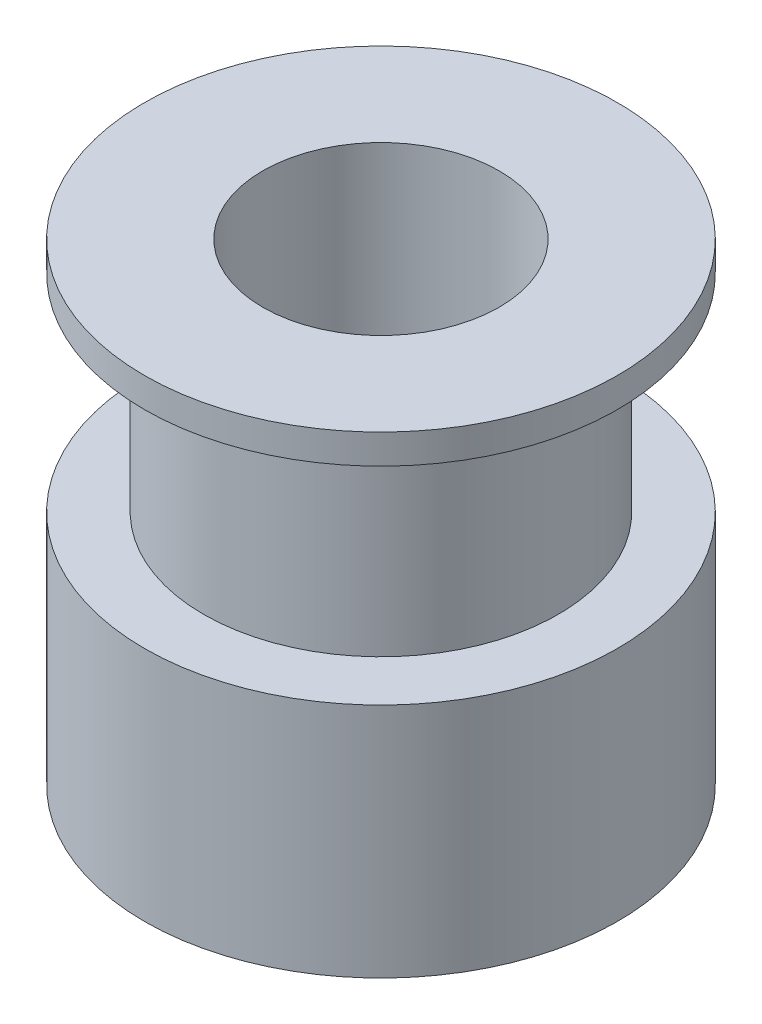
ISO-10303-21;
HEADER;
FILE_DESCRIPTION(('STEP AP214'),'2;1');
FILE_NAME('part.step','',(''),(''),'','','');
FILE_SCHEMA(('AUTOMOTIVE_DESIGN { 1 0 10303 214 1 1 1 1 }'));
ENDSEC;
DATA;
#1=APPLICATION_CONTEXT('core data for automotive mechanical design processes');
#2=APPLICATION_PROTOCOL_DEFINITION('international standard','automotive_design',2000,#1);
#3=PRODUCT_CONTEXT('',#1,'mechanical');
#4=PRODUCT('Part','Part','',(#3));
#5=PRODUCT_RELATED_PRODUCT_CATEGORY('part','',(#4));
#6=PRODUCT_DEFINITION_FORMATION('','',#4);
#7=PRODUCT_DEFINITION_CONTEXT('part definition',#1,'design');
#8=PRODUCT_DEFINITION('design','',#6,#7);
#9=PRODUCT_DEFINITION_SHAPE('','',#8);
#10=(LENGTH_UNIT() NAMED_UNIT(*) SI_UNIT(.MILLI.,.METRE.));
#11=(NAMED_UNIT(*) PLANE_ANGLE_UNIT() SI_UNIT($,.RADIAN.));
#12=(NAMED_UNIT(*) SI_UNIT($,.STERADIAN.) SOLID_ANGLE_UNIT());
#13=UNCERTAINTY_MEASURE_WITH_UNIT(LENGTH_MEASURE(1.E-05),#10,'distance_accuracy_value','');
#14=(GEOMETRIC_REPRESENTATION_CONTEXT(3) GLOBAL_UNCERTAINTY_ASSIGNED_CONTEXT((#13)) GLOBAL_UNIT_ASSIGNED_CONTEXT((#10,
#11,#12)) REPRESENTATION_CONTEXT('',''));
#15=CARTESIAN_POINT('',(0.,0.,0.));
#16=DIRECTION('',(0.,0.,1.));
#17=DIRECTION('',(1.,0.,0.));
#18=AXIS2_PLACEMENT_3D('',#15,#16,#17);
#19=CARTESIAN_POINT('',(0.,14.15,0.));
#20=DIRECTION('',(0.,1.,0.));
#21=DIRECTION('',(0.,0.,1.));
#22=AXIS2_PLACEMENT_3D('',#19,#20,#21);
#23=PLANE('',#22);
#24=CARTESIAN_POINT('',(0.,14.15,0.));
#25=DIRECTION('',(0.,-1.,0.));
#26=DIRECTION('',(0.,0.,-1.));
#27=AXIS2_PLACEMENT_3D('',#24,#25,#26);
#28=CIRCLE('',#27,4.);
#29=CARTESIAN_POINT('',(0.,14.15,-4.));
#30=VERTEX_POINT('',#29);
#31=EDGE_CURVE('E62',#30,#30,#28,.T.);
#32=ORIENTED_EDGE('',*,*,#31,.T.);
#33=EDGE_LOOP('',(#32));
#34=FACE_BOUND('',#33,.T.);
#35=CARTESIAN_POINT('',(0.,14.15,0.));
#36=DIRECTION('',(0.,1.,0.));
#37=DIRECTION('',(0.,0.,1.));
#38=AXIS2_PLACEMENT_3D('',#35,#36,#37);
#39=CIRCLE('',#38,8.);
#40=CARTESIAN_POINT('',(0.,14.15,8.));
#41=VERTEX_POINT('',#40);
#42=EDGE_CURVE('E10',#41,#41,#39,.T.);
#43=ORIENTED_EDGE('',*,*,#42,.T.);
#44=EDGE_LOOP('',(#43));
#45=FACE_BOUND('',#44,.T.);
#46=ADVANCED_FACE('F37',(#34,#45),#23,.T.);
#47=CARTESIAN_POINT('',(0.,15.9,0.));
#48=DIRECTION('',(0.,1.,0.));
#49=DIRECTION('',(0.,0.,1.));
#50=AXIS2_PLACEMENT_3D('',#47,#48,#49);
#51=CYLINDRICAL_SURFACE('',#50,8.);
#52=CARTESIAN_POINT('',(0.,13.15,0.));
#53=DIRECTION('',(0.,1.,0.));
#54=DIRECTION('',(0.,0.,1.));
#55=AXIS2_PLACEMENT_3D('',#52,#53,#54);
#56=CIRCLE('',#55,8.);
#57=CARTESIAN_POINT('',(0.,13.15,8.));
#58=VERTEX_POINT('',#57);
#59=EDGE_CURVE('E43',#58,#58,#56,.T.);
#60=ORIENTED_EDGE('',*,*,#59,.T.);
#61=EDGE_LOOP('',(#60));
#62=FACE_BOUND('',#61,.T.);
#63=ORIENTED_EDGE('',*,*,#42,.F.);
#64=EDGE_LOOP('',(#63));
#65=FACE_BOUND('',#64,.T.);
#66=ADVANCED_FACE('F103',(#62,#65),#51,.T.);
#67=CARTESIAN_POINT('',(-8.,13.15,0.));
#68=DIRECTION('',(0.,-1.,0.));
#69=DIRECTION('',(0.,0.,-1.));
#70=AXIS2_PLACEMENT_3D('',#67,#68,#69);
#71=PLANE('',#70);
#72=CARTESIAN_POINT('',(0.,13.15,0.));
#73=DIRECTION('',(0.,1.,0.));
#74=DIRECTION('',(0.,0.,1.));
#75=AXIS2_PLACEMENT_3D('',#72,#73,#74);
#76=CIRCLE('',#75,6.);
#77=CARTESIAN_POINT('',(0.,13.15,6.));
#78=VERTEX_POINT('',#77);
#79=EDGE_CURVE('E47',#78,#78,#76,.T.);
#80=ORIENTED_EDGE('',*,*,#79,.T.);
#81=EDGE_LOOP('',(#80));
#82=FACE_BOUND('',#81,.T.);
#83=ORIENTED_EDGE('',*,*,#59,.F.);
#84=EDGE_LOOP('',(#83));
#85=FACE_BOUND('',#84,.T.);
#86=ADVANCED_FACE('F97',(#82,#85),#71,.T.);
#87=CARTESIAN_POINT('',(0.,15.9,0.));
#88=DIRECTION('',(0.,1.,0.));
#89=DIRECTION('',(0.,0.,1.));
#90=AXIS2_PLACEMENT_3D('',#87,#88,#89);
#91=CYLINDRICAL_SURFACE('',#90,6.);
#92=CARTESIAN_POINT('',(0.,6.15,0.));
#93=DIRECTION('',(0.,1.,0.));
#94=DIRECTION('',(0.,0.,1.));
#95=AXIS2_PLACEMENT_3D('',#92,#93,#94);
#96=CIRCLE('',#95,6.);
#97=CARTESIAN_POINT('',(0.,6.15,6.));
#98=VERTEX_POINT('',#97);
#99=EDGE_CURVE('E51',#98,#98,#96,.T.);
#100=ORIENTED_EDGE('',*,*,#99,.T.);
#101=EDGE_LOOP('',(#100));
#102=FACE_BOUND('',#101,.T.);
#103=ORIENTED_EDGE('',*,*,#79,.F.);
#104=EDGE_LOOP('',(#103));
#105=FACE_BOUND('',#104,.T.);
#106=ADVANCED_FACE('F91',(#102,#105),#91,.T.);
#107=CARTESIAN_POINT('',(-6.,6.14999999999999,0.));
#108=DIRECTION('',(0.,1.,0.));
#109=DIRECTION('',(0.,0.,1.));
#110=AXIS2_PLACEMENT_3D('',#107,#108,#109);
#111=PLANE('',#110);
#112=CARTESIAN_POINT('',(0.,6.14999999999999,0.));
#113=DIRECTION('',(0.,1.,0.));
#114=DIRECTION('',(0.,0.,1.));
#115=AXIS2_PLACEMENT_3D('',#112,#113,#114);
#116=CIRCLE('',#115,8.);
#117=CARTESIAN_POINT('',(0.,6.14999999999999,8.));
#118=VERTEX_POINT('',#117);
#119=EDGE_CURVE('E56',#118,#118,#116,.T.);
#120=ORIENTED_EDGE('',*,*,#119,.T.);
#121=EDGE_LOOP('',(#120));
#122=FACE_BOUND('',#121,.T.);
#123=ORIENTED_EDGE('',*,*,#99,.F.);
#124=EDGE_LOOP('',(#123));
#125=FACE_BOUND('',#124,.T.);
#126=ADVANCED_FACE('F85',(#122,#125),#111,.T.);
#127=CARTESIAN_POINT('',(0.,15.9,0.));
#128=DIRECTION('',(0.,1.,0.));
#129=DIRECTION('',(0.,0.,1.));
#130=AXIS2_PLACEMENT_3D('',#127,#128,#129);
#131=CYLINDRICAL_SURFACE('',#130,8.);
#132=CARTESIAN_POINT('',(0.,-1.85,0.));
#133=DIRECTION('',(0.,1.,0.));
#134=DIRECTION('',(0.,0.,1.));
#135=AXIS2_PLACEMENT_3D('',#132,#133,#134);
#136=CIRCLE('',#135,8.);
#137=CARTESIAN_POINT('',(0.,-1.85,8.));
#138=VERTEX_POINT('',#137);
#139=EDGE_CURVE('E59',#138,#138,#136,.T.);
#140=ORIENTED_EDGE('',*,*,#139,.T.);
#141=EDGE_LOOP('',(#140));
#142=FACE_BOUND('',#141,.T.);
#143=ORIENTED_EDGE('',*,*,#119,.F.);
#144=EDGE_LOOP('',(#143));
#145=FACE_BOUND('',#144,.T.);
#146=ADVANCED_FACE('F79',(#142,#145),#131,.T.);
#147=CARTESIAN_POINT('',(-8.,-1.85,0.));
#148=DIRECTION('',(0.,-1.,0.));
#149=DIRECTION('',(0.,0.,-1.));
#150=AXIS2_PLACEMENT_3D('',#147,#148,#149);
#151=PLANE('',#150);
#152=CARTESIAN_POINT('',(0.,-1.85,0.));
#153=DIRECTION('',(0.,-1.,0.));
#154=DIRECTION('',(0.,0.,-1.));
#155=AXIS2_PLACEMENT_3D('',#152,#153,#154);
#156=CIRCLE('',#155,4.);
#157=CARTESIAN_POINT('',(0.,-1.85,-4.));
#158=VERTEX_POINT('',#157);
#159=EDGE_CURVE('E63',#158,#158,#156,.T.);
#160=ORIENTED_EDGE('',*,*,#159,.F.);
#161=EDGE_LOOP('',(#160));
#162=FACE_BOUND('',#161,.T.);
#163=ORIENTED_EDGE('',*,*,#139,.F.);
#164=EDGE_LOOP('',(#163));
#165=FACE_BOUND('',#164,.T.);
#166=ADVANCED_FACE('F73',(#162,#165),#151,.T.);
#167=CARTESIAN_POINT('',(0.,14.15,0.));
#168=DIRECTION('',(0.,-1.,0.));
#169=DIRECTION('',(0.,0.,-1.));
#170=AXIS2_PLACEMENT_3D('',#167,#168,#169);
#171=CYLINDRICAL_SURFACE('',#170,4.);
#172=ORIENTED_EDGE('',*,*,#31,.F.);
#173=EDGE_LOOP('',(#172));
#174=FACE_BOUND('',#173,.T.);
#175=ORIENTED_EDGE('',*,*,#159,.T.);
#176=EDGE_LOOP('',(#175));
#177=FACE_BOUND('',#176,.T.);
#178=ADVANCED_FACE('F70',(#174,#177),#171,.F.);
#179=CLOSED_SHELL('',(#46,#66,#86,#106,#126,#146,#166,#178));
#180=MANIFOLD_SOLID_BREP('B2',#179);
#181=ADVANCED_BREP_SHAPE_REPRESENTATION('',(#18,#180),#14);
#182=SHAPE_DEFINITION_REPRESENTATION(#9,#181);
ENDSEC;
END-ISO-10303-21;
